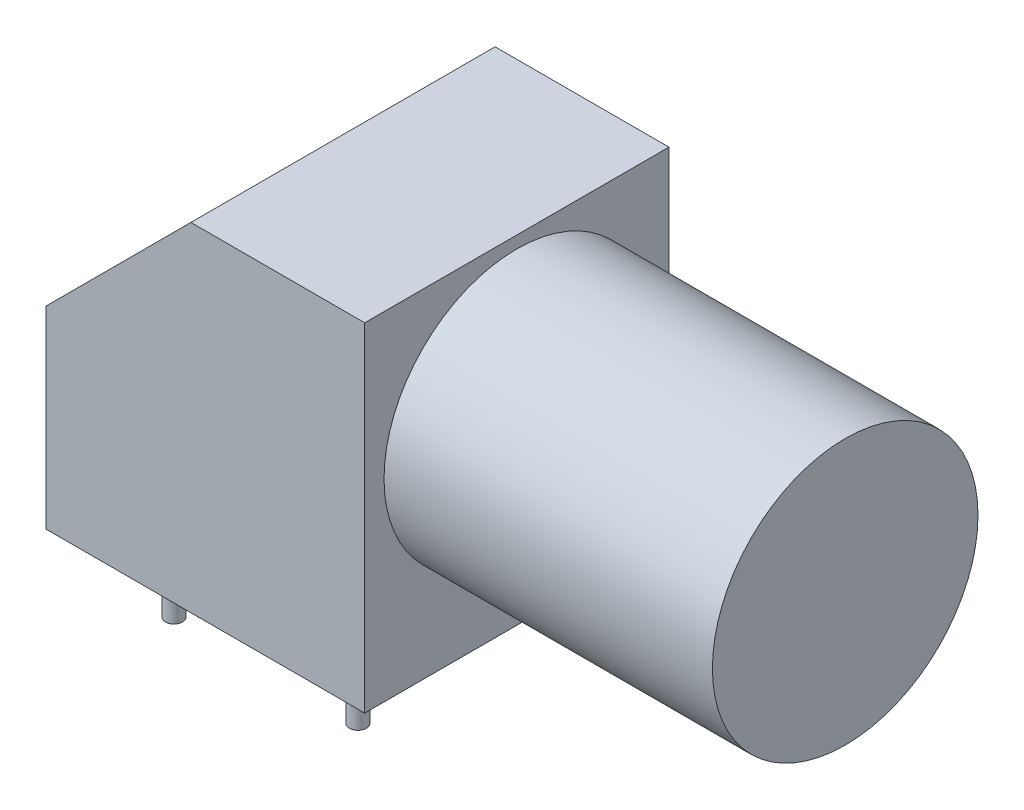
ISO-10303-21;
HEADER;
FILE_DESCRIPTION(('STEP AP214'),'2;1');
FILE_NAME('part.step','',(''),(''),'','','');
FILE_SCHEMA(('AUTOMOTIVE_DESIGN { 1 0 10303 214 1 1 1 1 }'));
ENDSEC;
DATA;
#1=APPLICATION_CONTEXT('core data for automotive mechanical design processes');
#2=APPLICATION_PROTOCOL_DEFINITION('international standard','automotive_design',2000,#1);
#3=PRODUCT_CONTEXT('',#1,'mechanical');
#4=PRODUCT('Part','Part','',(#3));
#5=PRODUCT_RELATED_PRODUCT_CATEGORY('part','',(#4));
#6=PRODUCT_DEFINITION_FORMATION('','',#4);
#7=PRODUCT_DEFINITION_CONTEXT('part definition',#1,'design');
#8=PRODUCT_DEFINITION('design','',#6,#7);
#9=PRODUCT_DEFINITION_SHAPE('','',#8);
#10=(LENGTH_UNIT() NAMED_UNIT(*) SI_UNIT(.MILLI.,.METRE.));
#11=(NAMED_UNIT(*) PLANE_ANGLE_UNIT() SI_UNIT($,.RADIAN.));
#12=(NAMED_UNIT(*) SI_UNIT($,.STERADIAN.) SOLID_ANGLE_UNIT());
#13=UNCERTAINTY_MEASURE_WITH_UNIT(LENGTH_MEASURE(1.E-05),#10,'distance_accuracy_value','');
#14=(GEOMETRIC_REPRESENTATION_CONTEXT(3) GLOBAL_UNCERTAINTY_ASSIGNED_CONTEXT((#13)) GLOBAL_UNIT_ASSIGNED_CONTEXT((#10,
#11,#12)) REPRESENTATION_CONTEXT('',''));
#15=CARTESIAN_POINT('',(0.,0.,0.));
#16=DIRECTION('',(0.,0.,1.));
#17=DIRECTION('',(1.,0.,0.));
#18=AXIS2_PLACEMENT_3D('',#15,#16,#17);
#19=CARTESIAN_POINT('',(0.,0.,-12.6));
#20=DIRECTION('',(0.,-1.,0.));
#21=DIRECTION('',(0.,0.,-1.));
#22=AXIS2_PLACEMENT_3D('',#19,#20,#21);
#23=PLANE('',#22);
#24=CARTESIAN_POINT('',(2.81,0.,-2.49));
#25=DIRECTION('',(0.,-1.,0.));
#26=DIRECTION('',(0.,0.,-1.));
#27=AXIS2_PLACEMENT_3D('',#24,#25,#26);
#28=CIRCLE('',#27,0.35);
#29=CARTESIAN_POINT('',(2.81,0.,-2.84));
#30=VERTEX_POINT('',#29);
#31=EDGE_CURVE('E277',#30,#30,#28,.T.);
#32=ORIENTED_EDGE('',*,*,#31,.F.);
#33=EDGE_LOOP('',(#32));
#34=FACE_BOUND('',#33,.T.);
#35=CARTESIAN_POINT('',(10.43,0.,-2.49));
#36=DIRECTION('',(0.,-1.,0.));
#37=DIRECTION('',(0.,0.,-1.));
#38=AXIS2_PLACEMENT_3D('',#35,#36,#37);
#39=CIRCLE('',#38,0.349999999999999);
#40=CARTESIAN_POINT('',(10.43,0.,-2.84));
#41=VERTEX_POINT('',#40);
#42=EDGE_CURVE('E294',#41,#41,#39,.T.);
#43=ORIENTED_EDGE('',*,*,#42,.F.);
#44=EDGE_LOOP('',(#43));
#45=FACE_BOUND('',#44,.T.);
#46=DIRECTION('',(0.,0.,1.));
#47=VECTOR('',#46,1.);
#48=CARTESIAN_POINT('',(0.,0.,0.));
#49=LINE('',#48,#47);
#50=CARTESIAN_POINT('',(0.,0.,-12.6));
#51=VERTEX_POINT('',#50);
#52=CARTESIAN_POINT('',(0.,0.,0.));
#53=VERTEX_POINT('',#52);
#54=EDGE_CURVE('E93',#51,#53,#49,.T.);
#55=ORIENTED_EDGE('',*,*,#54,.F.);
#56=DIRECTION('',(-1.,0.,0.));
#57=VECTOR('',#56,1.);
#58=CARTESIAN_POINT('',(0.,0.,-12.6));
#59=LINE('',#58,#57);
#60=CARTESIAN_POINT('',(13.2,0.,-12.6));
#61=VERTEX_POINT('',#60);
#62=EDGE_CURVE('E106',#61,#51,#59,.T.);
#63=ORIENTED_EDGE('',*,*,#62,.F.);
#64=DIRECTION('',(0.,0.,-1.));
#65=VECTOR('',#64,1.);
#66=CARTESIAN_POINT('',(13.2,0.,0.));
#67=LINE('',#66,#65);
#68=CARTESIAN_POINT('',(13.2,0.,0.));
#69=VERTEX_POINT('',#68);
#70=EDGE_CURVE('E94',#69,#61,#67,.T.);
#71=ORIENTED_EDGE('',*,*,#70,.F.);
#72=DIRECTION('',(1.,0.,0.));
#73=VECTOR('',#72,1.);
#74=CARTESIAN_POINT('',(0.,0.,0.));
#75=LINE('',#74,#73);
#76=EDGE_CURVE('E82',#53,#69,#75,.T.);
#77=ORIENTED_EDGE('',*,*,#76,.F.);
#78=EDGE_LOOP('',(#55,#63,#71,#77));
#79=FACE_BOUND('',#78,.T.);
#80=CARTESIAN_POINT('',(10.43,0.,-10.11));
#81=DIRECTION('',(0.,-1.,0.));
#82=DIRECTION('',(0.,0.,-1.));
#83=AXIS2_PLACEMENT_3D('',#80,#81,#82);
#84=CIRCLE('',#83,0.349999999999999);
#85=CARTESIAN_POINT('',(10.43,0.,-10.46));
#86=VERTEX_POINT('',#85);
#87=EDGE_CURVE('E288',#86,#86,#84,.T.);
#88=ORIENTED_EDGE('',*,*,#87,.F.);
#89=EDGE_LOOP('',(#88));
#90=FACE_BOUND('',#89,.T.);
#91=CARTESIAN_POINT('',(2.81,0.,-10.11));
#92=DIRECTION('',(0.,-1.,0.));
#93=DIRECTION('',(0.,0.,-1.));
#94=AXIS2_PLACEMENT_3D('',#91,#92,#93);
#95=CIRCLE('',#94,0.35);
#96=CARTESIAN_POINT('',(2.81,0.,-10.46));
#97=VERTEX_POINT('',#96);
#98=EDGE_CURVE('E278',#97,#97,#95,.T.);
#99=ORIENTED_EDGE('',*,*,#98,.F.);
#100=EDGE_LOOP('',(#99));
#101=FACE_BOUND('',#100,.T.);
#102=ADVANCED_FACE('F34',(#34,#45,#79,#90,#101),#23,.T.);
#103=CARTESIAN_POINT('',(13.2,14.,0.));
#104=DIRECTION('',(-1.,0.,0.));
#105=DIRECTION('',(0.,0.,1.));
#106=AXIS2_PLACEMENT_3D('',#103,#104,#105);
#107=PLANE('',#106);
#108=ORIENTED_EDGE('',*,*,#70,.T.);
#109=DIRECTION('',(0.,-1.,0.));
#110=VECTOR('',#109,1.);
#111=CARTESIAN_POINT('',(13.2,14.,-12.6));
#112=LINE('',#111,#110);
#113=CARTESIAN_POINT('',(13.2,14.,-12.6));
#114=VERTEX_POINT('',#113);
#115=EDGE_CURVE('E116',#114,#61,#112,.T.);
#116=ORIENTED_EDGE('',*,*,#115,.F.);
#117=DIRECTION('',(0.,0.,-1.));
#118=VECTOR('',#117,1.);
#119=CARTESIAN_POINT('',(13.2,14.,0.));
#120=LINE('',#119,#118);
#121=CARTESIAN_POINT('',(13.2,14.,0.));
#122=VERTEX_POINT('',#121);
#123=EDGE_CURVE('E110',#122,#114,#120,.T.);
#124=ORIENTED_EDGE('',*,*,#123,.F.);
#125=DIRECTION('',(0.,-1.,0.));
#126=VECTOR('',#125,1.);
#127=CARTESIAN_POINT('',(13.2,14.,0.));
#128=LINE('',#127,#126);
#129=EDGE_CURVE('E86',#122,#69,#128,.T.);
#130=ORIENTED_EDGE('',*,*,#129,.T.);
#131=EDGE_LOOP('',(#108,#116,#124,#130));
#132=FACE_BOUND('',#131,.T.);
#133=CARTESIAN_POINT('',(13.2,8.,-6.3));
#134=DIRECTION('',(-1.,0.,0.));
#135=DIRECTION('',(0.,0.,1.));
#136=AXIS2_PLACEMENT_3D('',#133,#134,#135);
#137=CIRCLE('',#136,5.5);
#138=CARTESIAN_POINT('',(13.2,8.,-0.800000000000002));
#139=VERTEX_POINT('',#138);
#140=EDGE_CURVE('E11',#139,#139,#137,.F.);
#141=ORIENTED_EDGE('',*,*,#140,.F.);
#142=EDGE_LOOP('',(#141));
#143=FACE_BOUND('',#142,.T.);
#144=ADVANCED_FACE('F147',(#132,#143),#107,.F.);
#145=CARTESIAN_POINT('',(0.,14.,0.));
#146=DIRECTION('',(1.,0.,0.));
#147=DIRECTION('',(0.,0.,-1.));
#148=AXIS2_PLACEMENT_3D('',#145,#146,#147);
#149=PLANE('',#148);
#150=DIRECTION('',(0.,-1.,0.));
#151=VECTOR('',#150,1.);
#152=CARTESIAN_POINT('',(0.,14.,0.));
#153=LINE('',#152,#151);
#154=CARTESIAN_POINT('',(0.,7.99999999999998,0.));
#155=VERTEX_POINT('',#154);
#156=EDGE_CURVE('E78',#155,#53,#153,.T.);
#157=ORIENTED_EDGE('',*,*,#156,.F.);
#158=DIRECTION('',(0.,0.,-1.));
#159=VECTOR('',#158,1.);
#160=CARTESIAN_POINT('',(0.,7.99999999999998,0.));
#161=LINE('',#160,#159);
#162=CARTESIAN_POINT('',(0.,7.99999999999998,-12.6));
#163=VERTEX_POINT('',#162);
#164=EDGE_CURVE('E49',#155,#163,#161,.T.);
#165=ORIENTED_EDGE('',*,*,#164,.T.);
#166=DIRECTION('',(0.,-1.,0.));
#167=VECTOR('',#166,1.);
#168=CARTESIAN_POINT('',(0.,14.,-12.6));
#169=LINE('',#168,#167);
#170=EDGE_CURVE('E96',#163,#51,#169,.T.);
#171=ORIENTED_EDGE('',*,*,#170,.T.);
#172=ORIENTED_EDGE('',*,*,#54,.T.);
#173=EDGE_LOOP('',(#157,#165,#171,#172));
#174=FACE_BOUND('',#173,.T.);
#175=ADVANCED_FACE('F36',(#174),#149,.F.);
#176=CARTESIAN_POINT('',(0.,14.,0.));
#177=DIRECTION('',(0.,0.,-1.));
#178=DIRECTION('',(-1.,0.,0.));
#179=AXIS2_PLACEMENT_3D('',#176,#177,#178);
#180=PLANE('',#179);
#181=DIRECTION('',(1.,0.,0.));
#182=VECTOR('',#181,1.);
#183=CARTESIAN_POINT('',(0.,14.,0.));
#184=LINE('',#183,#182);
#185=CARTESIAN_POINT('',(6.,14.,0.));
#186=VERTEX_POINT('',#185);
#187=EDGE_CURVE('E108',#186,#122,#184,.T.);
#188=ORIENTED_EDGE('',*,*,#187,.F.);
#189=DIRECTION('',(0.707106781186546,0.707106781186549,0.));
#190=VECTOR('',#189,1.);
#191=CARTESIAN_POINT('',(6.,14.,0.));
#192=LINE('',#191,#190);
#193=EDGE_CURVE('E57',#186,#155,#192,.F.);
#194=ORIENTED_EDGE('',*,*,#193,.T.);
#195=ORIENTED_EDGE('',*,*,#156,.T.);
#196=ORIENTED_EDGE('',*,*,#76,.T.);
#197=ORIENTED_EDGE('',*,*,#129,.F.);
#198=EDGE_LOOP('',(#188,#194,#195,#196,#197));
#199=FACE_BOUND('',#198,.T.);
#200=ADVANCED_FACE('F80',(#199),#180,.F.);
#201=CARTESIAN_POINT('',(0.,14.,-12.6));
#202=DIRECTION('',(0.,0.,1.));
#203=DIRECTION('',(1.,0.,0.));
#204=AXIS2_PLACEMENT_3D('',#201,#202,#203);
#205=PLANE('',#204);
#206=ORIENTED_EDGE('',*,*,#170,.F.);
#207=DIRECTION('',(-0.707106781186546,-0.707106781186549,0.));
#208=VECTOR('',#207,1.);
#209=CARTESIAN_POINT('',(6.,14.,-12.6));
#210=LINE('',#209,#208);
#211=CARTESIAN_POINT('',(6.,14.,-12.6));
#212=VERTEX_POINT('',#211);
#213=EDGE_CURVE('E42',#163,#212,#210,.F.);
#214=ORIENTED_EDGE('',*,*,#213,.T.);
#215=DIRECTION('',(-1.,0.,0.));
#216=VECTOR('',#215,1.);
#217=CARTESIAN_POINT('',(0.,14.,-12.6));
#218=LINE('',#217,#216);
#219=EDGE_CURVE('E112',#114,#212,#218,.T.);
#220=ORIENTED_EDGE('',*,*,#219,.F.);
#221=ORIENTED_EDGE('',*,*,#115,.T.);
#222=ORIENTED_EDGE('',*,*,#62,.T.);
#223=EDGE_LOOP('',(#206,#214,#220,#221,#222));
#224=FACE_BOUND('',#223,.T.);
#225=ADVANCED_FACE('F126',(#224),#205,.F.);
#226=CARTESIAN_POINT('',(0.,14.,-12.6));
#227=DIRECTION('',(0.,-1.,0.));
#228=DIRECTION('',(0.,0.,-1.));
#229=AXIS2_PLACEMENT_3D('',#226,#227,#228);
#230=PLANE('',#229);
#231=ORIENTED_EDGE('',*,*,#219,.T.);
#232=DIRECTION('',(0.,0.,1.));
#233=VECTOR('',#232,1.);
#234=CARTESIAN_POINT('',(6.,14.,-12.6));
#235=LINE('',#234,#233);
#236=EDGE_CURVE('E85',#212,#186,#235,.T.);
#237=ORIENTED_EDGE('',*,*,#236,.T.);
#238=ORIENTED_EDGE('',*,*,#187,.T.);
#239=ORIENTED_EDGE('',*,*,#123,.T.);
#240=EDGE_LOOP('',(#231,#237,#238,#239));
#241=FACE_BOUND('',#240,.T.);
#242=ADVANCED_FACE('F130',(#241),#230,.F.);
#243=CARTESIAN_POINT('',(6.,14.,-12.6));
#244=DIRECTION('',(0.707106781186549,-0.707106781186546,0.));
#245=DIRECTION('',(0.707106781186546,0.707106781186549,0.));
#246=AXIS2_PLACEMENT_3D('',#243,#244,#245);
#247=PLANE('',#246);
#248=ORIENTED_EDGE('',*,*,#213,.F.);
#249=ORIENTED_EDGE('',*,*,#164,.F.);
#250=ORIENTED_EDGE('',*,*,#193,.F.);
#251=ORIENTED_EDGE('',*,*,#236,.F.);
#252=EDGE_LOOP('',(#248,#249,#250,#251));
#253=FACE_BOUND('',#252,.T.);
#254=ADVANCED_FACE('F133',(#253),#247,.F.);
#255=CARTESIAN_POINT('',(26.8,8.,-6.3));
#256=DIRECTION('',(-1.,0.,0.));
#257=DIRECTION('',(0.,0.,1.));
#258=AXIS2_PLACEMENT_3D('',#255,#256,#257);
#259=CYLINDRICAL_SURFACE('',#258,5.5);
#260=CARTESIAN_POINT('',(26.8,8.,-6.3));
#261=DIRECTION('',(1.,0.,0.));
#262=DIRECTION('',(0.,0.,-1.));
#263=AXIS2_PLACEMENT_3D('',#260,#261,#262);
#264=CIRCLE('',#263,5.5);
#265=CARTESIAN_POINT('',(26.8,8.,-11.8));
#266=VERTEX_POINT('',#265);
#267=EDGE_CURVE('E98',#266,#266,#264,.T.);
#268=ORIENTED_EDGE('',*,*,#267,.F.);
#269=EDGE_LOOP('',(#268));
#270=FACE_BOUND('',#269,.T.);
#271=ORIENTED_EDGE('',*,*,#140,.T.);
#272=EDGE_LOOP('',(#271));
#273=FACE_BOUND('',#272,.T.);
#274=ADVANCED_FACE('F135',(#270,#273),#259,.T.);
#275=CARTESIAN_POINT('',(26.8,8.,-6.3));
#276=DIRECTION('',(1.,0.,0.));
#277=DIRECTION('',(0.,0.,-1.));
#278=AXIS2_PLACEMENT_3D('',#275,#276,#277);
#279=PLANE('',#278);
#280=ORIENTED_EDGE('',*,*,#267,.T.);
#281=EDGE_LOOP('',(#280));
#282=FACE_BOUND('',#281,.T.);
#283=ADVANCED_FACE('F141',(#282),#279,.T.);
#284=CARTESIAN_POINT('',(10.43,-3.,-2.49));
#285=DIRECTION('',(0.,1.,0.));
#286=DIRECTION('',(0.,0.,1.));
#287=AXIS2_PLACEMENT_3D('',#284,#285,#286);
#288=CYLINDRICAL_SURFACE('',#287,0.349999999999999);
#289=CARTESIAN_POINT('',(10.43,-3.,-2.49));
#290=DIRECTION('',(0.,-1.,0.));
#291=DIRECTION('',(0.,0.,-1.));
#292=AXIS2_PLACEMENT_3D('',#289,#290,#291);
#293=CIRCLE('',#292,0.349999999999999);
#294=CARTESIAN_POINT('',(10.43,-3.,-2.84));
#295=VERTEX_POINT('',#294);
#296=EDGE_CURVE('E101',#295,#295,#293,.T.);
#297=ORIENTED_EDGE('',*,*,#296,.F.);
#298=EDGE_LOOP('',(#297));
#299=FACE_BOUND('',#298,.T.);
#300=ORIENTED_EDGE('',*,*,#42,.T.);
#301=EDGE_LOOP('',(#300));
#302=FACE_BOUND('',#301,.T.);
#303=ADVANCED_FACE('F185',(#299,#302),#288,.T.);
#304=CARTESIAN_POINT('',(10.43,-3.,-2.49));
#305=DIRECTION('',(0.,-1.,0.));
#306=DIRECTION('',(0.,0.,-1.));
#307=AXIS2_PLACEMENT_3D('',#304,#305,#306);
#308=PLANE('',#307);
#309=ORIENTED_EDGE('',*,*,#296,.T.);
#310=EDGE_LOOP('',(#309));
#311=FACE_BOUND('',#310,.T.);
#312=ADVANCED_FACE('F200',(#311),#308,.T.);
#313=CARTESIAN_POINT('',(10.43,-3.,-10.11));
#314=DIRECTION('',(0.,1.,0.));
#315=DIRECTION('',(0.,0.,1.));
#316=AXIS2_PLACEMENT_3D('',#313,#314,#315);
#317=CYLINDRICAL_SURFACE('',#316,0.349999999999999);
#318=CARTESIAN_POINT('',(10.43,-3.,-10.11));
#319=DIRECTION('',(0.,-1.,0.));
#320=DIRECTION('',(0.,0.,-1.));
#321=AXIS2_PLACEMENT_3D('',#318,#319,#320);
#322=CIRCLE('',#321,0.349999999999999);
#323=CARTESIAN_POINT('',(10.43,-3.,-10.46));
#324=VERTEX_POINT('',#323);
#325=EDGE_CURVE('E291',#324,#324,#322,.T.);
#326=ORIENTED_EDGE('',*,*,#325,.F.);
#327=EDGE_LOOP('',(#326));
#328=FACE_BOUND('',#327,.T.);
#329=ORIENTED_EDGE('',*,*,#87,.T.);
#330=EDGE_LOOP('',(#329));
#331=FACE_BOUND('',#330,.T.);
#332=ADVANCED_FACE('F210',(#328,#331),#317,.T.);
#333=CARTESIAN_POINT('',(10.43,-3.,-10.11));
#334=DIRECTION('',(0.,-1.,0.));
#335=DIRECTION('',(0.,0.,-1.));
#336=AXIS2_PLACEMENT_3D('',#333,#334,#335);
#337=PLANE('',#336);
#338=ORIENTED_EDGE('',*,*,#325,.T.);
#339=EDGE_LOOP('',(#338));
#340=FACE_BOUND('',#339,.T.);
#341=ADVANCED_FACE('F220',(#340),#337,.T.);
#342=CARTESIAN_POINT('',(2.81,-3.,-2.49));
#343=DIRECTION('',(0.,1.,0.));
#344=DIRECTION('',(0.,0.,1.));
#345=AXIS2_PLACEMENT_3D('',#342,#343,#344);
#346=CYLINDRICAL_SURFACE('',#345,0.35);
#347=CARTESIAN_POINT('',(2.81,-3.,-2.49));
#348=DIRECTION('',(0.,-1.,0.));
#349=DIRECTION('',(0.,0.,-1.));
#350=AXIS2_PLACEMENT_3D('',#347,#348,#349);
#351=CIRCLE('',#350,0.35);
#352=CARTESIAN_POINT('',(2.81,-3.,-2.84));
#353=VERTEX_POINT('',#352);
#354=EDGE_CURVE('E281',#353,#353,#351,.T.);
#355=ORIENTED_EDGE('',*,*,#354,.F.);
#356=EDGE_LOOP('',(#355));
#357=FACE_BOUND('',#356,.T.);
#358=ORIENTED_EDGE('',*,*,#31,.T.);
#359=EDGE_LOOP('',(#358));
#360=FACE_BOUND('',#359,.T.);
#361=ADVANCED_FACE('F230',(#357,#360),#346,.T.);
#362=CARTESIAN_POINT('',(2.81,-3.,-2.49));
#363=DIRECTION('',(0.,-1.,0.));
#364=DIRECTION('',(0.,0.,-1.));
#365=AXIS2_PLACEMENT_3D('',#362,#363,#364);
#366=PLANE('',#365);
#367=ORIENTED_EDGE('',*,*,#354,.T.);
#368=EDGE_LOOP('',(#367));
#369=FACE_BOUND('',#368,.T.);
#370=ADVANCED_FACE('F240',(#369),#366,.T.);
#371=CARTESIAN_POINT('',(2.81,-3.,-10.11));
#372=DIRECTION('',(0.,1.,0.));
#373=DIRECTION('',(0.,0.,1.));
#374=AXIS2_PLACEMENT_3D('',#371,#372,#373);
#375=CYLINDRICAL_SURFACE('',#374,0.35);
#376=CARTESIAN_POINT('',(2.81,-3.,-10.11));
#377=DIRECTION('',(0.,-1.,0.));
#378=DIRECTION('',(0.,0.,-1.));
#379=AXIS2_PLACEMENT_3D('',#376,#377,#378);
#380=CIRCLE('',#379,0.35);
#381=CARTESIAN_POINT('',(2.81,-3.,-10.46));
#382=VERTEX_POINT('',#381);
#383=EDGE_CURVE('E276',#382,#382,#380,.T.);
#384=ORIENTED_EDGE('',*,*,#383,.F.);
#385=EDGE_LOOP('',(#384));
#386=FACE_BOUND('',#385,.T.);
#387=ORIENTED_EDGE('',*,*,#98,.T.);
#388=EDGE_LOOP('',(#387));
#389=FACE_BOUND('',#388,.T.);
#390=ADVANCED_FACE('F250',(#386,#389),#375,.T.);
#391=CARTESIAN_POINT('',(2.81,-3.,-10.11));
#392=DIRECTION('',(0.,-1.,0.));
#393=DIRECTION('',(0.,0.,-1.));
#394=AXIS2_PLACEMENT_3D('',#391,#392,#393);
#395=PLANE('',#394);
#396=ORIENTED_EDGE('',*,*,#383,.T.);
#397=EDGE_LOOP('',(#396));
#398=FACE_BOUND('',#397,.T.);
#399=ADVANCED_FACE('F260',(#398),#395,.T.);
#400=CLOSED_SHELL('',(#102,#144,#175,#200,#225,#242,#254,#274,#283,#303,#312,#332,#341,#361,
#370,#390,#399));
#401=MANIFOLD_SOLID_BREP('B2',#400);
#402=ADVANCED_BREP_SHAPE_REPRESENTATION('',(#18,#401),#14);
#403=SHAPE_DEFINITION_REPRESENTATION(#9,#402);
ENDSEC;
END-ISO-10303-21;
